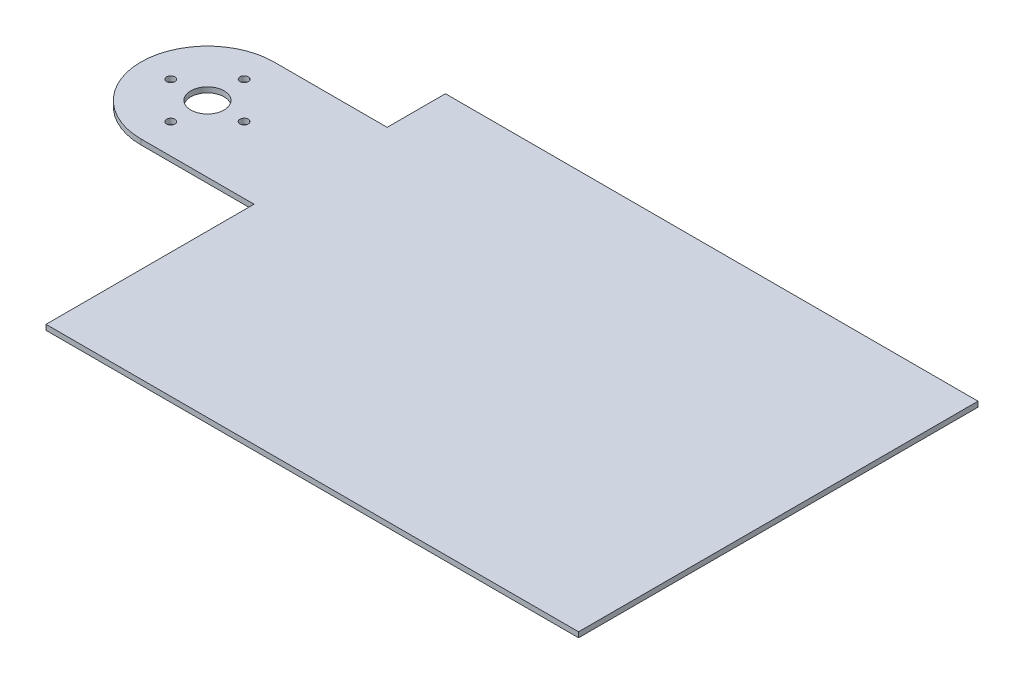
ISO-10303-21;
HEADER;
FILE_DESCRIPTION(('STEP AP214'),'2;1');
FILE_NAME('part.step','',(''),(''),'','','');
FILE_SCHEMA(('AUTOMOTIVE_DESIGN { 1 0 10303 214 1 1 1 1 }'));
ENDSEC;
DATA;
#1=APPLICATION_CONTEXT('core data for automotive mechanical design processes');
#2=APPLICATION_PROTOCOL_DEFINITION('international standard','automotive_design',2000,#1);
#3=PRODUCT_CONTEXT('',#1,'mechanical');
#4=PRODUCT('Part','Part','',(#3));
#5=PRODUCT_RELATED_PRODUCT_CATEGORY('part','',(#4));
#6=PRODUCT_DEFINITION_FORMATION('','',#4);
#7=PRODUCT_DEFINITION_CONTEXT('part definition',#1,'design');
#8=PRODUCT_DEFINITION('design','',#6,#7);
#9=PRODUCT_DEFINITION_SHAPE('','',#8);
#10=(LENGTH_UNIT() NAMED_UNIT(*) SI_UNIT(.MILLI.,.METRE.));
#11=(NAMED_UNIT(*) PLANE_ANGLE_UNIT() SI_UNIT($,.RADIAN.));
#12=(NAMED_UNIT(*) SI_UNIT($,.STERADIAN.) SOLID_ANGLE_UNIT());
#13=UNCERTAINTY_MEASURE_WITH_UNIT(LENGTH_MEASURE(1.E-05),#10,'distance_accuracy_value','');
#14=(GEOMETRIC_REPRESENTATION_CONTEXT(3) GLOBAL_UNCERTAINTY_ASSIGNED_CONTEXT((#13)) GLOBAL_UNIT_ASSIGNED_CONTEXT((#10,
#11,#12)) REPRESENTATION_CONTEXT('',''));
#15=CARTESIAN_POINT('',(0.,0.,0.));
#16=DIRECTION('',(0.,0.,1.));
#17=DIRECTION('',(1.,0.,0.));
#18=AXIS2_PLACEMENT_3D('',#15,#16,#17);
#19=CARTESIAN_POINT('',(0.,0.500000016,0.));
#20=DIRECTION('',(0.,1.,0.));
#21=DIRECTION('',(0.,0.,1.));
#22=AXIS2_PLACEMENT_3D('',#19,#20,#21);
#23=PLANE('',#22);
#24=CARTESIAN_POINT('',(0.,0.500000016,-6.99999997));
#25=DIRECTION('',(0.,1.,0.));
#26=DIRECTION('',(0.,0.,1.));
#27=AXIS2_PLACEMENT_3D('',#24,#25,#26);
#28=CIRCLE('',#27,0.800000051);
#29=CARTESIAN_POINT('',(0.,0.500000016,-6.199999919));
#30=VERTEX_POINT('',#29);
#31=EDGE_CURVE('E190',#30,#30,#28,.T.);
#32=ORIENTED_EDGE('',*,*,#31,.F.);
#33=EDGE_LOOP('',(#32));
#34=FACE_BOUND('',#33,.T.);
#35=CARTESIAN_POINT('',(0.,0.500000016,6.99999997));
#36=DIRECTION('',(0.,1.,0.));
#37=DIRECTION('',(0.,0.,1.));
#38=AXIS2_PLACEMENT_3D('',#35,#36,#37);
#39=CIRCLE('',#38,0.800000051);
#40=CARTESIAN_POINT('',(0.,0.500000016,7.800000021));
#41=VERTEX_POINT('',#40);
#42=EDGE_CURVE('E164',#41,#41,#39,.T.);
#43=ORIENTED_EDGE('',*,*,#42,.F.);
#44=EDGE_LOOP('',(#43));
#45=FACE_BOUND('',#44,.T.);
#46=CARTESIAN_POINT('',(0.,0.500000016,0.));
#47=DIRECTION('',(0.,1.,0.));
#48=DIRECTION('',(0.,0.,1.));
#49=AXIS2_PLACEMENT_3D('',#46,#47,#48);
#50=CIRCLE('',#49,12.7);
#51=CARTESIAN_POINT('',(0.,0.500000016,-12.7));
#52=VERTEX_POINT('',#51);
#53=CARTESIAN_POINT('',(0.,0.500000016,12.7));
#54=VERTEX_POINT('',#53);
#55=EDGE_CURVE('E165',#52,#54,#50,.T.);
#56=ORIENTED_EDGE('',*,*,#55,.T.);
#57=DIRECTION('',(1.,0.,0.));
#58=VECTOR('',#57,1.);
#59=CARTESIAN_POINT('',(21.59,0.500000016,12.7));
#60=LINE('',#59,#58);
#61=CARTESIAN_POINT('',(21.59,0.500000016,12.7));
#62=VERTEX_POINT('',#61);
#63=EDGE_CURVE('E102',#54,#62,#60,.T.);
#64=ORIENTED_EDGE('',*,*,#63,.T.);
#65=DIRECTION('',(0.,0.,1.));
#66=VECTOR('',#65,1.);
#67=CARTESIAN_POINT('',(21.59,0.500000016,52.3875));
#68=LINE('',#67,#66);
#69=CARTESIAN_POINT('',(21.59,0.500000016,52.3875));
#70=VERTEX_POINT('',#69);
#71=EDGE_CURVE('E178',#62,#70,#68,.T.);
#72=ORIENTED_EDGE('',*,*,#71,.T.);
#73=DIRECTION('',(1.,0.,0.));
#74=VECTOR('',#73,1.);
#75=CARTESIAN_POINT('',(21.59,0.500000016,52.3875));
#76=LINE('',#75,#74);
#77=CARTESIAN_POINT('',(123.19,0.500000016,52.3875));
#78=VERTEX_POINT('',#77);
#79=EDGE_CURVE('E181',#70,#78,#76,.T.);
#80=ORIENTED_EDGE('',*,*,#79,.T.);
#81=DIRECTION('',(0.,0.,-1.));
#82=VECTOR('',#81,1.);
#83=CARTESIAN_POINT('',(123.19,0.500000016,52.3875));
#84=LINE('',#83,#82);
#85=CARTESIAN_POINT('',(123.19,0.500000016,-23.8125));
#86=VERTEX_POINT('',#85);
#87=EDGE_CURVE('E121',#78,#86,#84,.T.);
#88=ORIENTED_EDGE('',*,*,#87,.T.);
#89=DIRECTION('',(-1.,0.,0.));
#90=VECTOR('',#89,1.);
#91=CARTESIAN_POINT('',(21.59,0.500000016,-23.8125));
#92=LINE('',#91,#90);
#93=CARTESIAN_POINT('',(21.59,0.500000016,-23.8125));
#94=VERTEX_POINT('',#93);
#95=EDGE_CURVE('E115',#86,#94,#92,.T.);
#96=ORIENTED_EDGE('',*,*,#95,.T.);
#97=DIRECTION('',(0.,0.,1.));
#98=VECTOR('',#97,1.);
#99=CARTESIAN_POINT('',(21.59,0.500000016,-12.7));
#100=LINE('',#99,#98);
#101=CARTESIAN_POINT('',(21.59,0.500000016,-12.7));
#102=VERTEX_POINT('',#101);
#103=EDGE_CURVE('E119',#94,#102,#100,.T.);
#104=ORIENTED_EDGE('',*,*,#103,.T.);
#105=DIRECTION('',(-1.,0.,0.));
#106=VECTOR('',#105,1.);
#107=CARTESIAN_POINT('',(0.,0.500000016,-12.7));
#108=LINE('',#107,#106);
#109=EDGE_CURVE('E59',#102,#52,#108,.T.);
#110=ORIENTED_EDGE('',*,*,#109,.T.);
#111=EDGE_LOOP('',(#56,#64,#72,#80,#88,#96,#104,#110));
#112=FACE_BOUND('',#111,.T.);
#113=CARTESIAN_POINT('',(6.99999997,0.500000016,0.));
#114=DIRECTION('',(0.,1.,0.));
#115=DIRECTION('',(0.,0.,1.));
#116=AXIS2_PLACEMENT_3D('',#113,#114,#115);
#117=CIRCLE('',#116,0.800000051);
#118=CARTESIAN_POINT('',(6.99999997,0.500000016,0.800000051));
#119=VERTEX_POINT('',#118);
#120=EDGE_CURVE('E152',#119,#119,#117,.T.);
#121=ORIENTED_EDGE('',*,*,#120,.F.);
#122=EDGE_LOOP('',(#121));
#123=FACE_BOUND('',#122,.T.);
#124=CARTESIAN_POINT('',(-6.99999997,0.500000016,0.));
#125=DIRECTION('',(0.,1.,0.));
#126=DIRECTION('',(0.,0.,1.));
#127=AXIS2_PLACEMENT_3D('',#124,#125,#126);
#128=CIRCLE('',#127,0.800000051000002);
#129=CARTESIAN_POINT('',(-6.99999997,0.500000016,0.800000051000003));
#130=VERTEX_POINT('',#129);
#131=EDGE_CURVE('E198',#130,#130,#128,.T.);
#132=ORIENTED_EDGE('',*,*,#131,.F.);
#133=EDGE_LOOP('',(#132));
#134=FACE_BOUND('',#133,.T.);
#135=CARTESIAN_POINT('',(0.,0.500000016,0.));
#136=DIRECTION('',(0.,1.,0.));
#137=DIRECTION('',(0.,0.,1.));
#138=AXIS2_PLACEMENT_3D('',#135,#136,#137);
#139=CIRCLE('',#138,3.175);
#140=CARTESIAN_POINT('',(0.,0.500000016,3.175));
#141=VERTEX_POINT('',#140);
#142=EDGE_CURVE('E201',#141,#141,#139,.T.);
#143=ORIENTED_EDGE('',*,*,#142,.F.);
#144=EDGE_LOOP('',(#143));
#145=FACE_BOUND('',#144,.T.);
#146=ADVANCED_FACE('F42',(#34,#45,#112,#123,#134,#145),#23,.T.);
#147=CARTESIAN_POINT('',(0.,-0.500000016,0.));
#148=DIRECTION('',(0.,1.,0.));
#149=DIRECTION('',(0.,0.,1.));
#150=AXIS2_PLACEMENT_3D('',#147,#148,#149);
#151=PLANE('',#150);
#152=CARTESIAN_POINT('',(0.,-0.500000016,0.));
#153=DIRECTION('',(0.,1.,0.));
#154=DIRECTION('',(0.,0.,1.));
#155=AXIS2_PLACEMENT_3D('',#152,#153,#154);
#156=CIRCLE('',#155,12.7);
#157=CARTESIAN_POINT('',(0.,-0.500000016,-12.7));
#158=VERTEX_POINT('',#157);
#159=CARTESIAN_POINT('',(0.,-0.500000016,12.7));
#160=VERTEX_POINT('',#159);
#161=EDGE_CURVE('E158',#158,#160,#156,.T.);
#162=ORIENTED_EDGE('',*,*,#161,.F.);
#163=DIRECTION('',(-1.,0.,0.));
#164=VECTOR('',#163,1.);
#165=CARTESIAN_POINT('',(0.,-0.500000016,-12.7));
#166=LINE('',#165,#164);
#167=CARTESIAN_POINT('',(21.59,-0.500000016,-12.7));
#168=VERTEX_POINT('',#167);
#169=EDGE_CURVE('E94',#168,#158,#166,.T.);
#170=ORIENTED_EDGE('',*,*,#169,.F.);
#171=DIRECTION('',(0.,0.,1.));
#172=VECTOR('',#171,1.);
#173=CARTESIAN_POINT('',(21.59,-0.500000016,-12.7));
#174=LINE('',#173,#172);
#175=CARTESIAN_POINT('',(21.59,-0.500000016,-23.8125));
#176=VERTEX_POINT('',#175);
#177=EDGE_CURVE('E88',#176,#168,#174,.T.);
#178=ORIENTED_EDGE('',*,*,#177,.F.);
#179=DIRECTION('',(-1.,0.,0.));
#180=VECTOR('',#179,1.);
#181=CARTESIAN_POINT('',(21.59,-0.500000016,-23.8125));
#182=LINE('',#181,#180);
#183=CARTESIAN_POINT('',(123.19,-0.500000016,-23.8125));
#184=VERTEX_POINT('',#183);
#185=EDGE_CURVE('E130',#184,#176,#182,.T.);
#186=ORIENTED_EDGE('',*,*,#185,.F.);
#187=DIRECTION('',(0.,0.,-1.));
#188=VECTOR('',#187,1.);
#189=CARTESIAN_POINT('',(123.19,-0.500000016,52.3875));
#190=LINE('',#189,#188);
#191=CARTESIAN_POINT('',(123.19,-0.500000016,52.3875));
#192=VERTEX_POINT('',#191);
#193=EDGE_CURVE('E284',#192,#184,#190,.T.);
#194=ORIENTED_EDGE('',*,*,#193,.F.);
#195=DIRECTION('',(1.,0.,0.));
#196=VECTOR('',#195,1.);
#197=CARTESIAN_POINT('',(21.59,-0.500000016,52.3875));
#198=LINE('',#197,#196);
#199=CARTESIAN_POINT('',(21.59,-0.500000016,52.3875));
#200=VERTEX_POINT('',#199);
#201=EDGE_CURVE('E282',#200,#192,#198,.T.);
#202=ORIENTED_EDGE('',*,*,#201,.F.);
#203=DIRECTION('',(0.,0.,1.));
#204=VECTOR('',#203,1.);
#205=CARTESIAN_POINT('',(21.59,-0.500000016,52.3875));
#206=LINE('',#205,#204);
#207=CARTESIAN_POINT('',(21.59,-0.500000016,12.7));
#208=VERTEX_POINT('',#207);
#209=EDGE_CURVE('E274',#208,#200,#206,.T.);
#210=ORIENTED_EDGE('',*,*,#209,.F.);
#211=DIRECTION('',(1.,0.,0.));
#212=VECTOR('',#211,1.);
#213=CARTESIAN_POINT('',(21.59,-0.500000016,12.7));
#214=LINE('',#213,#212);
#215=EDGE_CURVE('E267',#160,#208,#214,.T.);
#216=ORIENTED_EDGE('',*,*,#215,.F.);
#217=EDGE_LOOP('',(#162,#170,#178,#186,#194,#202,#210,#216));
#218=FACE_BOUND('',#217,.T.);
#219=CARTESIAN_POINT('',(6.99999997,-0.500000016,0.));
#220=DIRECTION('',(0.,1.,0.));
#221=DIRECTION('',(0.,0.,1.));
#222=AXIS2_PLACEMENT_3D('',#219,#220,#221);
#223=CIRCLE('',#222,0.800000051);
#224=CARTESIAN_POINT('',(6.99999997,-0.500000016,0.800000051));
#225=VERTEX_POINT('',#224);
#226=EDGE_CURVE('E159',#225,#225,#223,.T.);
#227=ORIENTED_EDGE('',*,*,#226,.T.);
#228=EDGE_LOOP('',(#227));
#229=FACE_BOUND('',#228,.T.);
#230=CARTESIAN_POINT('',(0.,-0.500000016,6.99999997));
#231=DIRECTION('',(0.,1.,0.));
#232=DIRECTION('',(0.,0.,1.));
#233=AXIS2_PLACEMENT_3D('',#230,#231,#232);
#234=CIRCLE('',#233,0.800000051);
#235=CARTESIAN_POINT('',(0.,-0.500000016,7.800000021));
#236=VERTEX_POINT('',#235);
#237=EDGE_CURVE('E160',#236,#236,#234,.T.);
#238=ORIENTED_EDGE('',*,*,#237,.T.);
#239=EDGE_LOOP('',(#238));
#240=FACE_BOUND('',#239,.T.);
#241=CARTESIAN_POINT('',(-6.99999997,-0.500000016,0.));
#242=DIRECTION('',(0.,1.,0.));
#243=DIRECTION('',(0.,0.,1.));
#244=AXIS2_PLACEMENT_3D('',#241,#242,#243);
#245=CIRCLE('',#244,0.800000051000002);
#246=CARTESIAN_POINT('',(-6.99999997,-0.500000016,0.800000051000003));
#247=VERTEX_POINT('',#246);
#248=EDGE_CURVE('E192',#247,#247,#245,.T.);
#249=ORIENTED_EDGE('',*,*,#248,.T.);
#250=EDGE_LOOP('',(#249));
#251=FACE_BOUND('',#250,.T.);
#252=CARTESIAN_POINT('',(0.,-0.500000016,-6.99999997));
#253=DIRECTION('',(0.,1.,0.));
#254=DIRECTION('',(0.,0.,1.));
#255=AXIS2_PLACEMENT_3D('',#252,#253,#254);
#256=CIRCLE('',#255,0.800000051);
#257=CARTESIAN_POINT('',(0.,-0.500000016,-6.199999919));
#258=VERTEX_POINT('',#257);
#259=EDGE_CURVE('E193',#258,#258,#256,.T.);
#260=ORIENTED_EDGE('',*,*,#259,.T.);
#261=EDGE_LOOP('',(#260));
#262=FACE_BOUND('',#261,.T.);
#263=CARTESIAN_POINT('',(0.,-0.500000016,0.));
#264=DIRECTION('',(0.,1.,0.));
#265=DIRECTION('',(0.,0.,1.));
#266=AXIS2_PLACEMENT_3D('',#263,#264,#265);
#267=CIRCLE('',#266,3.175);
#268=CARTESIAN_POINT('',(0.,-0.500000016,3.175));
#269=VERTEX_POINT('',#268);
#270=EDGE_CURVE('E205',#269,#269,#267,.T.);
#271=ORIENTED_EDGE('',*,*,#270,.T.);
#272=EDGE_LOOP('',(#271));
#273=FACE_BOUND('',#272,.T.);
#274=ADVANCED_FACE('F216',(#218,#229,#240,#251,#262,#273),#151,.F.);
#275=CARTESIAN_POINT('',(0.,0.500000016,0.));
#276=DIRECTION('',(0.,-1.,0.));
#277=DIRECTION('',(0.,0.,-1.));
#278=AXIS2_PLACEMENT_3D('',#275,#276,#277);
#279=CYLINDRICAL_SURFACE('',#278,12.7);
#280=ORIENTED_EDGE('',*,*,#161,.T.);
#281=DIRECTION('',(0.,-1.,0.));
#282=VECTOR('',#281,1.);
#283=CARTESIAN_POINT('',(0.,0.500000016,12.7));
#284=LINE('',#283,#282);
#285=EDGE_CURVE('E12',#54,#160,#284,.T.);
#286=ORIENTED_EDGE('',*,*,#285,.F.);
#287=ORIENTED_EDGE('',*,*,#55,.F.);
#288=DIRECTION('',(0.,-1.,0.));
#289=VECTOR('',#288,1.);
#290=CARTESIAN_POINT('',(0.,0.500000016,-12.7));
#291=LINE('',#290,#289);
#292=EDGE_CURVE('E138',#52,#158,#291,.T.);
#293=ORIENTED_EDGE('',*,*,#292,.T.);
#294=EDGE_LOOP('',(#280,#286,#287,#293));
#295=FACE_BOUND('',#294,.T.);
#296=ADVANCED_FACE('F44',(#295),#279,.T.);
#297=CARTESIAN_POINT('',(21.59,0.500000016,12.7));
#298=DIRECTION('',(0.,0.,-1.));
#299=DIRECTION('',(-1.,0.,0.));
#300=AXIS2_PLACEMENT_3D('',#297,#298,#299);
#301=PLANE('',#300);
#302=ORIENTED_EDGE('',*,*,#215,.T.);
#303=DIRECTION('',(0.,-1.,0.));
#304=VECTOR('',#303,1.);
#305=CARTESIAN_POINT('',(21.59,0.500000016,12.7));
#306=LINE('',#305,#304);
#307=EDGE_CURVE('E51',#62,#208,#306,.T.);
#308=ORIENTED_EDGE('',*,*,#307,.F.);
#309=ORIENTED_EDGE('',*,*,#63,.F.);
#310=ORIENTED_EDGE('',*,*,#285,.T.);
#311=EDGE_LOOP('',(#302,#308,#309,#310));
#312=FACE_BOUND('',#311,.T.);
#313=ADVANCED_FACE('F260',(#312),#301,.F.);
#314=CARTESIAN_POINT('',(21.59,0.500000016,52.3875));
#315=DIRECTION('',(1.,0.,0.));
#316=DIRECTION('',(0.,0.,-1.));
#317=AXIS2_PLACEMENT_3D('',#314,#315,#316);
#318=PLANE('',#317);
#319=ORIENTED_EDGE('',*,*,#209,.T.);
#320=DIRECTION('',(0.,-1.,0.));
#321=VECTOR('',#320,1.);
#322=CARTESIAN_POINT('',(21.59,0.500000016,52.3875));
#323=LINE('',#322,#321);
#324=EDGE_CURVE('E278',#70,#200,#323,.T.);
#325=ORIENTED_EDGE('',*,*,#324,.F.);
#326=ORIENTED_EDGE('',*,*,#71,.F.);
#327=ORIENTED_EDGE('',*,*,#307,.T.);
#328=EDGE_LOOP('',(#319,#325,#326,#327));
#329=FACE_BOUND('',#328,.T.);
#330=ADVANCED_FACE('F257',(#329),#318,.F.);
#331=CARTESIAN_POINT('',(21.59,0.500000016,52.3875));
#332=DIRECTION('',(0.,0.,-1.));
#333=DIRECTION('',(-1.,0.,0.));
#334=AXIS2_PLACEMENT_3D('',#331,#332,#333);
#335=PLANE('',#334);
#336=ORIENTED_EDGE('',*,*,#201,.T.);
#337=DIRECTION('',(0.,-1.,0.));
#338=VECTOR('',#337,1.);
#339=CARTESIAN_POINT('',(123.19,0.500000016,52.3875));
#340=LINE('',#339,#338);
#341=EDGE_CURVE('E294',#78,#192,#340,.T.);
#342=ORIENTED_EDGE('',*,*,#341,.F.);
#343=ORIENTED_EDGE('',*,*,#79,.F.);
#344=ORIENTED_EDGE('',*,*,#324,.T.);
#345=EDGE_LOOP('',(#336,#342,#343,#344));
#346=FACE_BOUND('',#345,.T.);
#347=ADVANCED_FACE('F253',(#346),#335,.F.);
#348=CARTESIAN_POINT('',(123.19,0.500000016,52.3875));
#349=DIRECTION('',(-1.,0.,0.));
#350=DIRECTION('',(0.,0.,1.));
#351=AXIS2_PLACEMENT_3D('',#348,#349,#350);
#352=PLANE('',#351);
#353=ORIENTED_EDGE('',*,*,#193,.T.);
#354=DIRECTION('',(0.,-1.,0.));
#355=VECTOR('',#354,1.);
#356=CARTESIAN_POINT('',(123.19,0.500000016,-23.8125));
#357=LINE('',#356,#355);
#358=EDGE_CURVE('E131',#86,#184,#357,.T.);
#359=ORIENTED_EDGE('',*,*,#358,.F.);
#360=ORIENTED_EDGE('',*,*,#87,.F.);
#361=ORIENTED_EDGE('',*,*,#341,.T.);
#362=EDGE_LOOP('',(#353,#359,#360,#361));
#363=FACE_BOUND('',#362,.T.);
#364=ADVANCED_FACE('F250',(#363),#352,.F.);
#365=CARTESIAN_POINT('',(21.59,0.500000016,-23.8125));
#366=DIRECTION('',(0.,0.,1.));
#367=DIRECTION('',(1.,0.,0.));
#368=AXIS2_PLACEMENT_3D('',#365,#366,#367);
#369=PLANE('',#368);
#370=ORIENTED_EDGE('',*,*,#185,.T.);
#371=DIRECTION('',(0.,-1.,0.));
#372=VECTOR('',#371,1.);
#373=CARTESIAN_POINT('',(21.59,0.500000016,-23.8125));
#374=LINE('',#373,#372);
#375=EDGE_CURVE('E127',#94,#176,#374,.T.);
#376=ORIENTED_EDGE('',*,*,#375,.F.);
#377=ORIENTED_EDGE('',*,*,#95,.F.);
#378=ORIENTED_EDGE('',*,*,#358,.T.);
#379=EDGE_LOOP('',(#370,#376,#377,#378));
#380=FACE_BOUND('',#379,.T.);
#381=ADVANCED_FACE('F128',(#380),#369,.F.);
#382=CARTESIAN_POINT('',(21.59,0.500000016,-12.7));
#383=DIRECTION('',(1.,0.,0.));
#384=DIRECTION('',(0.,0.,-1.));
#385=AXIS2_PLACEMENT_3D('',#382,#383,#384);
#386=PLANE('',#385);
#387=ORIENTED_EDGE('',*,*,#177,.T.);
#388=DIRECTION('',(0.,-1.,0.));
#389=VECTOR('',#388,1.);
#390=CARTESIAN_POINT('',(21.59,0.500000016,-12.7));
#391=LINE('',#390,#389);
#392=EDGE_CURVE('E132',#102,#168,#391,.T.);
#393=ORIENTED_EDGE('',*,*,#392,.F.);
#394=ORIENTED_EDGE('',*,*,#103,.F.);
#395=ORIENTED_EDGE('',*,*,#375,.T.);
#396=EDGE_LOOP('',(#387,#393,#394,#395));
#397=FACE_BOUND('',#396,.T.);
#398=ADVANCED_FACE('F134',(#397),#386,.F.);
#399=CARTESIAN_POINT('',(0.,0.500000016,-12.7));
#400=DIRECTION('',(0.,0.,1.));
#401=DIRECTION('',(1.,0.,0.));
#402=AXIS2_PLACEMENT_3D('',#399,#400,#401);
#403=PLANE('',#402);
#404=ORIENTED_EDGE('',*,*,#169,.T.);
#405=ORIENTED_EDGE('',*,*,#292,.F.);
#406=ORIENTED_EDGE('',*,*,#109,.F.);
#407=ORIENTED_EDGE('',*,*,#392,.T.);
#408=EDGE_LOOP('',(#404,#405,#406,#407));
#409=FACE_BOUND('',#408,.T.);
#410=ADVANCED_FACE('F231',(#409),#403,.F.);
#411=CARTESIAN_POINT('',(6.99999997,0.500000016,0.));
#412=DIRECTION('',(0.,-1.,0.));
#413=DIRECTION('',(0.,0.,-1.));
#414=AXIS2_PLACEMENT_3D('',#411,#412,#413);
#415=CYLINDRICAL_SURFACE('',#414,0.800000051);
#416=ORIENTED_EDGE('',*,*,#120,.T.);
#417=EDGE_LOOP('',(#416));
#418=FACE_BOUND('',#417,.T.);
#419=ORIENTED_EDGE('',*,*,#226,.F.);
#420=EDGE_LOOP('',(#419));
#421=FACE_BOUND('',#420,.T.);
#422=ADVANCED_FACE('F222',(#418,#421),#415,.F.);
#423=CARTESIAN_POINT('',(0.,0.500000016,6.99999997));
#424=DIRECTION('',(0.,-1.,0.));
#425=DIRECTION('',(0.,0.,-1.));
#426=AXIS2_PLACEMENT_3D('',#423,#424,#425);
#427=CYLINDRICAL_SURFACE('',#426,0.800000051);
#428=ORIENTED_EDGE('',*,*,#42,.T.);
#429=EDGE_LOOP('',(#428));
#430=FACE_BOUND('',#429,.T.);
#431=ORIENTED_EDGE('',*,*,#237,.F.);
#432=EDGE_LOOP('',(#431));
#433=FACE_BOUND('',#432,.T.);
#434=ADVANCED_FACE('F219',(#430,#433),#427,.F.);
#435=CARTESIAN_POINT('',(-6.99999997,0.500000016,0.));
#436=DIRECTION('',(0.,-1.,0.));
#437=DIRECTION('',(0.,0.,-1.));
#438=AXIS2_PLACEMENT_3D('',#435,#436,#437);
#439=CYLINDRICAL_SURFACE('',#438,0.800000051000002);
#440=ORIENTED_EDGE('',*,*,#131,.T.);
#441=EDGE_LOOP('',(#440));
#442=FACE_BOUND('',#441,.T.);
#443=ORIENTED_EDGE('',*,*,#248,.F.);
#444=EDGE_LOOP('',(#443));
#445=FACE_BOUND('',#444,.T.);
#446=ADVANCED_FACE('F221',(#442,#445),#439,.F.);
#447=CARTESIAN_POINT('',(0.,0.500000016,-6.99999997));
#448=DIRECTION('',(0.,-1.,0.));
#449=DIRECTION('',(0.,0.,-1.));
#450=AXIS2_PLACEMENT_3D('',#447,#448,#449);
#451=CYLINDRICAL_SURFACE('',#450,0.800000051);
#452=ORIENTED_EDGE('',*,*,#31,.T.);
#453=EDGE_LOOP('',(#452));
#454=FACE_BOUND('',#453,.T.);
#455=ORIENTED_EDGE('',*,*,#259,.F.);
#456=EDGE_LOOP('',(#455));
#457=FACE_BOUND('',#456,.T.);
#458=ADVANCED_FACE('F229',(#454,#457),#451,.F.);
#459=CARTESIAN_POINT('',(0.,0.500000016,0.));
#460=DIRECTION('',(0.,-1.,0.));
#461=DIRECTION('',(0.,0.,-1.));
#462=AXIS2_PLACEMENT_3D('',#459,#460,#461);
#463=CYLINDRICAL_SURFACE('',#462,3.175);
#464=ORIENTED_EDGE('',*,*,#142,.T.);
#465=EDGE_LOOP('',(#464));
#466=FACE_BOUND('',#465,.T.);
#467=ORIENTED_EDGE('',*,*,#270,.F.);
#468=EDGE_LOOP('',(#467));
#469=FACE_BOUND('',#468,.T.);
#470=ADVANCED_FACE('F387',(#466,#469),#463,.F.);
#471=CLOSED_SHELL('',(#146,#274,#296,#313,#330,#347,#364,#381,#398,#410,#422,#434,#446,#458,#470));
#472=MANIFOLD_SOLID_BREP('B2',#471);
#473=ADVANCED_BREP_SHAPE_REPRESENTATION('',(#18,#472),#14);
#474=SHAPE_DEFINITION_REPRESENTATION(#9,#473);
ENDSEC;
END-ISO-10303-21;
